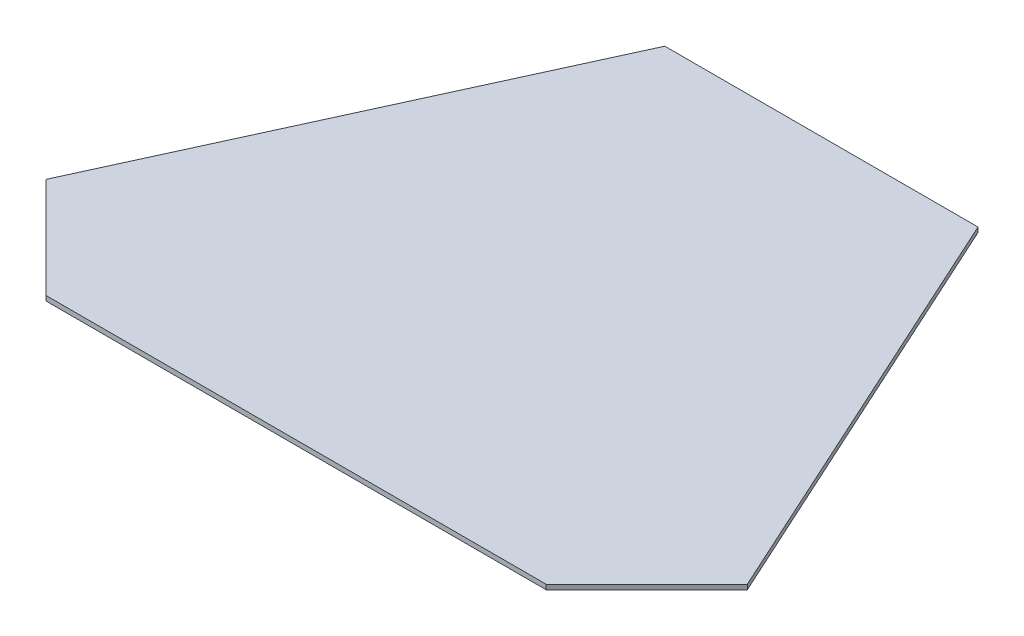
ISO-10303-21;
HEADER;
FILE_DESCRIPTION(('STEP AP214'),'2;1');
FILE_NAME('part.step','',(''),(''),'','','');
FILE_SCHEMA(('AUTOMOTIVE_DESIGN { 1 0 10303 214 1 1 1 1 }'));
ENDSEC;
DATA;
#1=APPLICATION_CONTEXT('core data for automotive mechanical design processes');
#2=APPLICATION_PROTOCOL_DEFINITION('international standard','automotive_design',2000,#1);
#3=PRODUCT_CONTEXT('',#1,'mechanical');
#4=PRODUCT('Part','Part','',(#3));
#5=PRODUCT_RELATED_PRODUCT_CATEGORY('part','',(#4));
#6=PRODUCT_DEFINITION_FORMATION('','',#4);
#7=PRODUCT_DEFINITION_CONTEXT('part definition',#1,'design');
#8=PRODUCT_DEFINITION('design','',#6,#7);
#9=PRODUCT_DEFINITION_SHAPE('','',#8);
#10=(LENGTH_UNIT() NAMED_UNIT(*) SI_UNIT(.MILLI.,.METRE.));
#11=(NAMED_UNIT(*) PLANE_ANGLE_UNIT() SI_UNIT($,.RADIAN.));
#12=(NAMED_UNIT(*) SI_UNIT($,.STERADIAN.) SOLID_ANGLE_UNIT());
#13=UNCERTAINTY_MEASURE_WITH_UNIT(LENGTH_MEASURE(1.E-05),#10,'distance_accuracy_value','');
#14=(GEOMETRIC_REPRESENTATION_CONTEXT(3) GLOBAL_UNCERTAINTY_ASSIGNED_CONTEXT((#13)) GLOBAL_UNIT_ASSIGNED_CONTEXT((#10,
#11,#12)) REPRESENTATION_CONTEXT('',''));
#15=CARTESIAN_POINT('',(0.,0.,0.));
#16=DIRECTION('',(0.,0.,1.));
#17=DIRECTION('',(1.,0.,0.));
#18=AXIS2_PLACEMENT_3D('',#15,#16,#17);
#19=CARTESIAN_POINT('',(0.,2.9972,0.));
#20=DIRECTION('',(0.,0.,1.));
#21=DIRECTION('',(1.,0.,0.));
#22=AXIS2_PLACEMENT_3D('',#19,#20,#21);
#23=PLANE('',#22);
#24=DIRECTION('',(0.,1.,0.));
#25=VECTOR('',#24,1.);
#26=CARTESIAN_POINT('',(315.903157035008,0.,1.11022302462516E-13));
#27=LINE('',#26,#25);
#28=CARTESIAN_POINT('',(315.903157035008,0.,1.11022302462516E-13));
#29=VERTEX_POINT('',#28);
#30=CARTESIAN_POINT('',(315.903157035008,2.9972,1.11022302462516E-13));
#31=VERTEX_POINT('',#30);
#32=EDGE_CURVE('E124',#29,#31,#27,.T.);
#33=ORIENTED_EDGE('',*,*,#32,.F.);
#34=DIRECTION('',(-1.,0.,0.));
#35=VECTOR('',#34,1.);
#36=CARTESIAN_POINT('',(0.,0.,0.));
#37=LINE('',#36,#35);
#38=CARTESIAN_POINT('',(120.844478045886,0.,0.));
#39=VERTEX_POINT('',#38);
#40=EDGE_CURVE('E36',#29,#39,#37,.T.);
#41=ORIENTED_EDGE('',*,*,#40,.T.);
#42=DIRECTION('',(0.,1.,0.));
#43=VECTOR('',#42,1.);
#44=CARTESIAN_POINT('',(120.844478045886,0.,1.66533453693773E-13));
#45=LINE('',#44,#43);
#46=CARTESIAN_POINT('',(120.844478045886,2.9972,1.66533453693773E-13));
#47=VERTEX_POINT('',#46);
#48=EDGE_CURVE('E47',#39,#47,#45,.T.);
#49=ORIENTED_EDGE('',*,*,#48,.T.);
#50=DIRECTION('',(-1.,0.,0.));
#51=VECTOR('',#50,1.);
#52=CARTESIAN_POINT('',(0.,2.9972,0.));
#53=LINE('',#52,#51);
#54=EDGE_CURVE('E12',#31,#47,#53,.T.);
#55=ORIENTED_EDGE('',*,*,#54,.F.);
#56=EDGE_LOOP('',(#33,#41,#49,#55));
#57=FACE_BOUND('',#56,.T.);
#58=ADVANCED_FACE('F33',(#57),#23,.F.);
#59=CARTESIAN_POINT('',(0.,2.9972,0.));
#60=DIRECTION('',(0.,1.,0.));
#61=DIRECTION('',(0.,0.,1.));
#62=AXIS2_PLACEMENT_3D('',#59,#60,#61);
#63=PLANE('',#62);
#64=DIRECTION('',(0.707106781186546,0.,-0.707106781186549));
#65=VECTOR('',#64,1.);
#66=CARTESIAN_POINT('',(436.747635080894,2.9972,264.516499207225));
#67=LINE('',#66,#65);
#68=CARTESIAN_POINT('',(374.133645972255,2.9972,327.130488315864));
#69=VERTEX_POINT('',#68);
#70=CARTESIAN_POINT('',(436.747635080894,2.9972,264.516499207225));
#71=VERTEX_POINT('',#70);
#72=EDGE_CURVE('E118',#69,#71,#67,.T.);
#73=ORIENTED_EDGE('',*,*,#72,.T.);
#74=DIRECTION('',(-0.415539745397157,0.,-0.909575021642122));
#75=VECTOR('',#74,1.);
#76=CARTESIAN_POINT('',(315.903157035008,2.9972,1.11022302462516E-13));
#77=LINE('',#76,#75);
#78=EDGE_CURVE('E121',#71,#31,#77,.T.);
#79=ORIENTED_EDGE('',*,*,#78,.T.);
#80=ORIENTED_EDGE('',*,*,#54,.T.);
#81=DIRECTION('',(-0.415539745397157,0.,0.909575021642121));
#82=VECTOR('',#81,1.);
#83=CARTESIAN_POINT('',(1.11022302462516E-13,2.9972,264.516499207225));
#84=LINE('',#83,#82);
#85=CARTESIAN_POINT('',(1.11022302462516E-13,2.9972,264.516499207225));
#86=VERTEX_POINT('',#85);
#87=EDGE_CURVE('E112',#47,#86,#84,.T.);
#88=ORIENTED_EDGE('',*,*,#87,.T.);
#89=DIRECTION('',(0.707106781186547,0.,0.707106781186548));
#90=VECTOR('',#89,1.);
#91=CARTESIAN_POINT('',(62.6139891086389,2.9972,327.130488315864));
#92=LINE('',#91,#90);
#93=CARTESIAN_POINT('',(62.6139891086389,2.9972,327.130488315864));
#94=VERTEX_POINT('',#93);
#95=EDGE_CURVE('E115',#86,#94,#92,.T.);
#96=ORIENTED_EDGE('',*,*,#95,.T.);
#97=DIRECTION('',(1.,0.,0.));
#98=VECTOR('',#97,1.);
#99=CARTESIAN_POINT('',(374.133645972255,2.9972,327.130488315864));
#100=LINE('',#99,#98);
#101=EDGE_CURVE('E92',#94,#69,#100,.T.);
#102=ORIENTED_EDGE('',*,*,#101,.T.);
#103=EDGE_LOOP('',(#73,#79,#80,#88,#96,#102));
#104=FACE_BOUND('',#103,.T.);
#105=ADVANCED_FACE('F136',(#104),#63,.T.);
#106=CARTESIAN_POINT('',(0.,0.,0.));
#107=DIRECTION('',(0.,1.,0.));
#108=DIRECTION('',(0.,0.,1.));
#109=AXIS2_PLACEMENT_3D('',#106,#107,#108);
#110=PLANE('',#109);
#111=DIRECTION('',(-0.415539745397157,0.,-0.909575021642122));
#112=VECTOR('',#111,1.);
#113=CARTESIAN_POINT('',(315.903157035008,0.,1.11022302462516E-13));
#114=LINE('',#113,#112);
#115=CARTESIAN_POINT('',(436.747635080894,0.,264.516499207225));
#116=VERTEX_POINT('',#115);
#117=EDGE_CURVE('E107',#116,#29,#114,.T.);
#118=ORIENTED_EDGE('',*,*,#117,.F.);
#119=DIRECTION('',(0.707106781186546,0.,-0.707106781186549));
#120=VECTOR('',#119,1.);
#121=CARTESIAN_POINT('',(436.747635080894,0.,264.516499207225));
#122=LINE('',#121,#120);
#123=CARTESIAN_POINT('',(374.133645972255,0.,327.130488315864));
#124=VERTEX_POINT('',#123);
#125=EDGE_CURVE('E105',#124,#116,#122,.T.);
#126=ORIENTED_EDGE('',*,*,#125,.F.);
#127=DIRECTION('',(1.,0.,0.));
#128=VECTOR('',#127,1.);
#129=CARTESIAN_POINT('',(374.133645972255,0.,327.130488315864));
#130=LINE('',#129,#128);
#131=CARTESIAN_POINT('',(62.6139891086389,0.,327.130488315864));
#132=VERTEX_POINT('',#131);
#133=EDGE_CURVE('E89',#132,#124,#130,.T.);
#134=ORIENTED_EDGE('',*,*,#133,.F.);
#135=DIRECTION('',(0.707106781186547,0.,0.707106781186548));
#136=VECTOR('',#135,1.);
#137=CARTESIAN_POINT('',(62.6139891086389,0.,327.130488315864));
#138=LINE('',#137,#136);
#139=CARTESIAN_POINT('',(1.17961196366423E-13,0.,264.516499207225));
#140=VERTEX_POINT('',#139);
#141=EDGE_CURVE('E97',#140,#132,#138,.T.);
#142=ORIENTED_EDGE('',*,*,#141,.F.);
#143=DIRECTION('',(-0.415539745397157,0.,0.909575021642121));
#144=VECTOR('',#143,1.);
#145=CARTESIAN_POINT('',(1.11022302462516E-13,0.,264.516499207225));
#146=LINE('',#145,#144);
#147=EDGE_CURVE('E100',#39,#140,#146,.T.);
#148=ORIENTED_EDGE('',*,*,#147,.F.);
#149=ORIENTED_EDGE('',*,*,#40,.F.);
#150=EDGE_LOOP('',(#118,#126,#134,#142,#148,#149));
#151=FACE_BOUND('',#150,.T.);
#152=ADVANCED_FACE('F103',(#151),#110,.F.);
#153=CARTESIAN_POINT('',(315.903157035008,0.,1.11022302462516E-13));
#154=DIRECTION('',(0.909575021642122,0.,-0.415539745397157));
#155=DIRECTION('',(-0.415539745397157,0.,-0.909575021642122));
#156=AXIS2_PLACEMENT_3D('',#153,#154,#155);
#157=PLANE('',#156);
#158=ORIENTED_EDGE('',*,*,#78,.F.);
#159=DIRECTION('',(0.,1.,0.));
#160=VECTOR('',#159,1.);
#161=CARTESIAN_POINT('',(436.747635080894,0.,264.516499207225));
#162=LINE('',#161,#160);
#163=EDGE_CURVE('E126',#116,#71,#162,.T.);
#164=ORIENTED_EDGE('',*,*,#163,.F.);
#165=ORIENTED_EDGE('',*,*,#117,.T.);
#166=ORIENTED_EDGE('',*,*,#32,.T.);
#167=EDGE_LOOP('',(#158,#164,#165,#166));
#168=FACE_BOUND('',#167,.T.);
#169=ADVANCED_FACE('F140',(#168),#157,.T.);
#170=CARTESIAN_POINT('',(436.747635080894,0.,264.516499207225));
#171=DIRECTION('',(0.707106781186549,0.,0.707106781186546));
#172=DIRECTION('',(0.707106781186546,0.,-0.707106781186549));
#173=AXIS2_PLACEMENT_3D('',#170,#171,#172);
#174=PLANE('',#173);
#175=ORIENTED_EDGE('',*,*,#72,.F.);
#176=DIRECTION('',(0.,1.,0.));
#177=VECTOR('',#176,1.);
#178=CARTESIAN_POINT('',(374.133645972255,0.,327.130488315864));
#179=LINE('',#178,#177);
#180=EDGE_CURVE('E94',#124,#69,#179,.T.);
#181=ORIENTED_EDGE('',*,*,#180,.F.);
#182=ORIENTED_EDGE('',*,*,#125,.T.);
#183=ORIENTED_EDGE('',*,*,#163,.T.);
#184=EDGE_LOOP('',(#175,#181,#182,#183));
#185=FACE_BOUND('',#184,.T.);
#186=ADVANCED_FACE('F159',(#185),#174,.T.);
#187=CARTESIAN_POINT('',(374.133645972255,0.,327.130488315864));
#188=DIRECTION('',(0.,0.,1.));
#189=DIRECTION('',(1.,0.,0.));
#190=AXIS2_PLACEMENT_3D('',#187,#188,#189);
#191=PLANE('',#190);
#192=ORIENTED_EDGE('',*,*,#101,.F.);
#193=DIRECTION('',(0.,1.,0.));
#194=VECTOR('',#193,1.);
#195=CARTESIAN_POINT('',(62.6139891086389,0.,327.130488315864));
#196=LINE('',#195,#194);
#197=EDGE_CURVE('E86',#132,#94,#196,.T.);
#198=ORIENTED_EDGE('',*,*,#197,.F.);
#199=ORIENTED_EDGE('',*,*,#133,.T.);
#200=ORIENTED_EDGE('',*,*,#180,.T.);
#201=EDGE_LOOP('',(#192,#198,#199,#200));
#202=FACE_BOUND('',#201,.T.);
#203=ADVANCED_FACE('F87',(#202),#191,.T.);
#204=CARTESIAN_POINT('',(62.6139891086389,0.,327.130488315864));
#205=DIRECTION('',(-0.707106781186548,0.,0.707106781186547));
#206=DIRECTION('',(0.707106781186547,0.,0.707106781186548));
#207=AXIS2_PLACEMENT_3D('',#204,#205,#206);
#208=PLANE('',#207);
#209=ORIENTED_EDGE('',*,*,#95,.F.);
#210=DIRECTION('',(0.,1.,0.));
#211=VECTOR('',#210,1.);
#212=CARTESIAN_POINT('',(1.11022302462516E-13,0.,264.516499207225));
#213=LINE('',#212,#211);
#214=EDGE_CURVE('E55',#140,#86,#213,.T.);
#215=ORIENTED_EDGE('',*,*,#214,.F.);
#216=ORIENTED_EDGE('',*,*,#141,.T.);
#217=ORIENTED_EDGE('',*,*,#197,.T.);
#218=EDGE_LOOP('',(#209,#215,#216,#217));
#219=FACE_BOUND('',#218,.T.);
#220=ADVANCED_FACE('F98',(#219),#208,.T.);
#221=CARTESIAN_POINT('',(1.11022302462516E-13,0.,264.516499207225));
#222=DIRECTION('',(-0.909575021642121,0.,-0.415539745397157));
#223=DIRECTION('',(-0.415539745397157,0.,0.909575021642121));
#224=AXIS2_PLACEMENT_3D('',#221,#222,#223);
#225=PLANE('',#224);
#226=ORIENTED_EDGE('',*,*,#87,.F.);
#227=ORIENTED_EDGE('',*,*,#48,.F.);
#228=ORIENTED_EDGE('',*,*,#147,.T.);
#229=ORIENTED_EDGE('',*,*,#214,.T.);
#230=EDGE_LOOP('',(#226,#227,#228,#229));
#231=FACE_BOUND('',#230,.T.);
#232=ADVANCED_FACE('F141',(#231),#225,.T.);
#233=CLOSED_SHELL('',(#58,#105,#152,#169,#186,#203,#220,#232));
#234=MANIFOLD_SOLID_BREP('B2',#233);
#235=ADVANCED_BREP_SHAPE_REPRESENTATION('',(#18,#234),#14);
#236=SHAPE_DEFINITION_REPRESENTATION(#9,#235);
ENDSEC;
END-ISO-10303-21;
